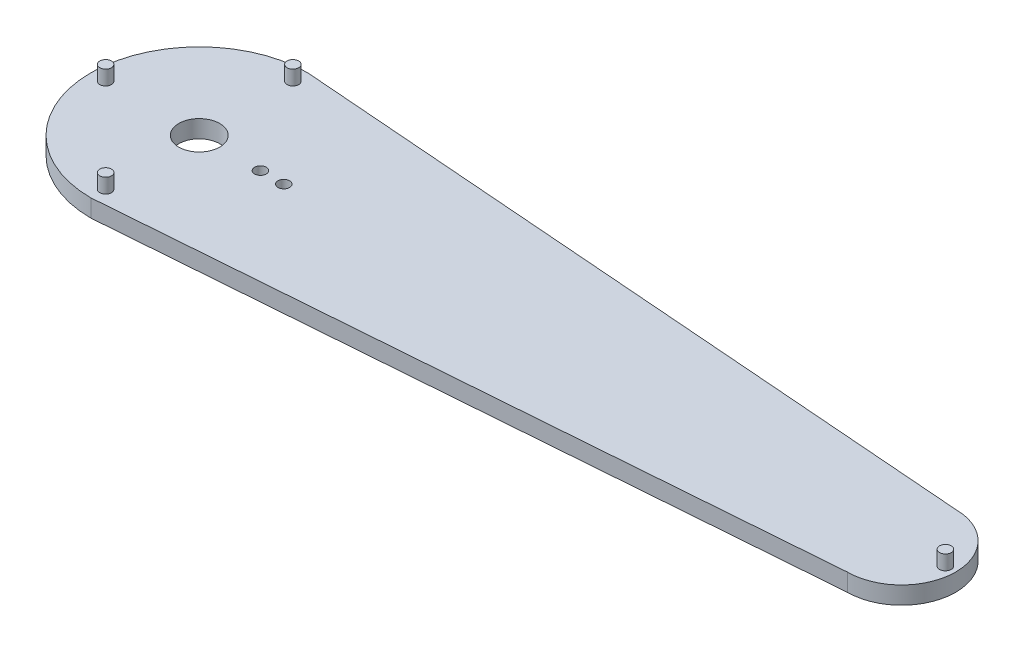
ISO-10303-21;
HEADER;
FILE_DESCRIPTION(('STEP AP214'),'2;1');
FILE_NAME('part.step','',(''),(''),'','','');
FILE_SCHEMA(('AUTOMOTIVE_DESIGN { 1 0 10303 214 1 1 1 1 }'));
ENDSEC;
DATA;
#1=APPLICATION_CONTEXT('core data for automotive mechanical design processes');
#2=APPLICATION_PROTOCOL_DEFINITION('international standard','automotive_design',2000,#1);
#3=PRODUCT_CONTEXT('',#1,'mechanical');
#4=PRODUCT('Part','Part','',(#3));
#5=PRODUCT_RELATED_PRODUCT_CATEGORY('part','',(#4));
#6=PRODUCT_DEFINITION_FORMATION('','',#4);
#7=PRODUCT_DEFINITION_CONTEXT('part definition',#1,'design');
#8=PRODUCT_DEFINITION('design','',#6,#7);
#9=PRODUCT_DEFINITION_SHAPE('','',#8);
#10=(LENGTH_UNIT() NAMED_UNIT(*) SI_UNIT(.MILLI.,.METRE.));
#11=(NAMED_UNIT(*) PLANE_ANGLE_UNIT() SI_UNIT($,.RADIAN.));
#12=(NAMED_UNIT(*) SI_UNIT($,.STERADIAN.) SOLID_ANGLE_UNIT());
#13=UNCERTAINTY_MEASURE_WITH_UNIT(LENGTH_MEASURE(1.E-05),#10,'distance_accuracy_value','');
#14=(GEOMETRIC_REPRESENTATION_CONTEXT(3) GLOBAL_UNCERTAINTY_ASSIGNED_CONTEXT((#13)) GLOBAL_UNIT_ASSIGNED_CONTEXT((#10,
#11,#12)) REPRESENTATION_CONTEXT('',''));
#15=CARTESIAN_POINT('',(0.,0.,0.));
#16=DIRECTION('',(0.,0.,1.));
#17=DIRECTION('',(1.,0.,0.));
#18=AXIS2_PLACEMENT_3D('',#15,#16,#17);
#19=CARTESIAN_POINT('',(0.,3.,0.));
#20=DIRECTION('',(0.,1.,0.));
#21=DIRECTION('',(0.,0.,1.));
#22=AXIS2_PLACEMENT_3D('',#19,#20,#21);
#23=PLANE('',#22);
#24=CARTESIAN_POINT('',(127.5,3.,0.));
#25=DIRECTION('',(0.,1.,0.));
#26=DIRECTION('',(0.,0.,1.));
#27=AXIS2_PLACEMENT_3D('',#24,#25,#26);
#28=CIRCLE('',#27,0.999999999999998);
#29=CARTESIAN_POINT('',(127.5,3.,0.999999999999998));
#30=VERTEX_POINT('',#29);
#31=EDGE_CURVE('E178',#30,#30,#28,.T.);
#32=ORIENTED_EDGE('',*,*,#31,.F.);
#33=EDGE_LOOP('',(#32));
#34=FACE_BOUND('',#33,.T.);
#35=CARTESIAN_POINT('',(0.,3.,16.));
#36=DIRECTION('',(0.,1.,0.));
#37=DIRECTION('',(0.,0.,1.));
#38=AXIS2_PLACEMENT_3D('',#35,#36,#37);
#39=CIRCLE('',#38,1.);
#40=CARTESIAN_POINT('',(0.,3.,17.));
#41=VERTEX_POINT('',#40);
#42=EDGE_CURVE('E170',#41,#41,#39,.T.);
#43=ORIENTED_EDGE('',*,*,#42,.F.);
#44=EDGE_LOOP('',(#43));
#45=FACE_BOUND('',#44,.T.);
#46=CARTESIAN_POINT('',(0.,3.,-16.));
#47=DIRECTION('',(0.,1.,0.));
#48=DIRECTION('',(0.,0.,1.));
#49=AXIS2_PLACEMENT_3D('',#46,#47,#48);
#50=CIRCLE('',#49,1.);
#51=CARTESIAN_POINT('',(0.,3.,-15.));
#52=VERTEX_POINT('',#51);
#53=EDGE_CURVE('E162',#52,#52,#50,.T.);
#54=ORIENTED_EDGE('',*,*,#53,.F.);
#55=EDGE_LOOP('',(#54));
#56=FACE_BOUND('',#55,.T.);
#57=CARTESIAN_POINT('',(-16.,3.,0.));
#58=DIRECTION('',(0.,1.,0.));
#59=DIRECTION('',(0.,0.,1.));
#60=AXIS2_PLACEMENT_3D('',#57,#58,#59);
#61=CIRCLE('',#60,1.);
#62=CARTESIAN_POINT('',(-16.,3.,1.));
#63=VERTEX_POINT('',#62);
#64=EDGE_CURVE('E158',#63,#63,#61,.T.);
#65=ORIENTED_EDGE('',*,*,#64,.F.);
#66=EDGE_LOOP('',(#65));
#67=FACE_BOUND('',#66,.T.);
#68=CARTESIAN_POINT('',(14.45,3.,0.));
#69=DIRECTION('',(0.,1.,0.));
#70=DIRECTION('',(0.,0.,1.));
#71=AXIS2_PLACEMENT_3D('',#68,#69,#70);
#72=CIRCLE('',#71,1.);
#73=CARTESIAN_POINT('',(14.45,3.,1.));
#74=VERTEX_POINT('',#73);
#75=EDGE_CURVE('E138',#74,#74,#72,.T.);
#76=ORIENTED_EDGE('',*,*,#75,.F.);
#77=EDGE_LOOP('',(#76));
#78=FACE_BOUND('',#77,.T.);
#79=CARTESIAN_POINT('',(0.,3.,0.));
#80=DIRECTION('',(0.,1.,0.));
#81=DIRECTION('',(0.,0.,1.));
#82=AXIS2_PLACEMENT_3D('',#79,#80,#81);
#83=CIRCLE('',#82,18.5169503651855);
#84=CARTESIAN_POINT('',(0.,3.,-18.5169503651855));
#85=VERTEX_POINT('',#84);
#86=CARTESIAN_POINT('',(0.,3.,18.5169503651855));
#87=VERTEX_POINT('',#86);
#88=EDGE_CURVE('E96',#85,#87,#83,.T.);
#89=ORIENTED_EDGE('',*,*,#88,.T.);
#90=DIRECTION('',(0.997036855802212,0.,-0.0769253415464591));
#91=VECTOR('',#90,1.);
#92=CARTESIAN_POINT('',(0.,3.,18.5169503651855));
#93=LINE('',#92,#91);
#94=CARTESIAN_POINT('',(120.,3.,9.25847518259273));
#95=VERTEX_POINT('',#94);
#96=EDGE_CURVE('E91',#87,#95,#93,.T.);
#97=ORIENTED_EDGE('',*,*,#96,.T.);
#98=CARTESIAN_POINT('',(120.,3.,0.));
#99=DIRECTION('',(0.,1.,0.));
#100=DIRECTION('',(0.,0.,1.));
#101=AXIS2_PLACEMENT_3D('',#98,#99,#100);
#102=CIRCLE('',#101,9.25847518259273);
#103=CARTESIAN_POINT('',(120.,3.,-9.25847518259273));
#104=VERTEX_POINT('',#103);
#105=EDGE_CURVE('E94',#95,#104,#102,.T.);
#106=ORIENTED_EDGE('',*,*,#105,.T.);
#107=DIRECTION('',(-0.997036855802212,0.,-0.0769253415464591));
#108=VECTOR('',#107,1.);
#109=CARTESIAN_POINT('',(0.,3.,-18.5169503651855));
#110=LINE('',#109,#108);
#111=EDGE_CURVE('E61',#104,#85,#110,.T.);
#112=ORIENTED_EDGE('',*,*,#111,.T.);
#113=EDGE_LOOP('',(#89,#97,#106,#112));
#114=FACE_BOUND('',#113,.T.);
#115=CARTESIAN_POINT('',(0.,3.,0.));
#116=DIRECTION('',(0.,1.,0.));
#117=DIRECTION('',(0.,0.,1.));
#118=AXIS2_PLACEMENT_3D('',#115,#116,#117);
#119=CIRCLE('',#118,3.5);
#120=CARTESIAN_POINT('',(0.,3.,3.5));
#121=VERTEX_POINT('',#120);
#122=EDGE_CURVE('E116',#121,#121,#119,.T.);
#123=ORIENTED_EDGE('',*,*,#122,.F.);
#124=EDGE_LOOP('',(#123));
#125=FACE_BOUND('',#124,.T.);
#126=CARTESIAN_POINT('',(10.45,3.,0.));
#127=DIRECTION('',(0.,1.,0.));
#128=DIRECTION('',(0.,0.,1.));
#129=AXIS2_PLACEMENT_3D('',#126,#127,#128);
#130=CIRCLE('',#129,1.);
#131=CARTESIAN_POINT('',(10.45,3.,1.));
#132=VERTEX_POINT('',#131);
#133=EDGE_CURVE('E146',#132,#132,#130,.T.);
#134=ORIENTED_EDGE('',*,*,#133,.F.);
#135=EDGE_LOOP('',(#134));
#136=FACE_BOUND('',#135,.T.);
#137=ADVANCED_FACE('F43',(#34,#45,#56,#67,#78,#114,#125,#136),#23,.T.);
#138=CARTESIAN_POINT('',(0.,0.,0.));
#139=DIRECTION('',(0.,1.,0.));
#140=DIRECTION('',(0.,0.,1.));
#141=AXIS2_PLACEMENT_3D('',#138,#139,#140);
#142=PLANE('',#141);
#143=CARTESIAN_POINT('',(0.,0.,0.));
#144=DIRECTION('',(0.,1.,0.));
#145=DIRECTION('',(0.,0.,1.));
#146=AXIS2_PLACEMENT_3D('',#143,#144,#145);
#147=CIRCLE('',#146,18.5169503651855);
#148=CARTESIAN_POINT('',(0.,0.,-18.5169503651855));
#149=VERTEX_POINT('',#148);
#150=CARTESIAN_POINT('',(0.,0.,18.5169503651855));
#151=VERTEX_POINT('',#150);
#152=EDGE_CURVE('E112',#149,#151,#147,.T.);
#153=ORIENTED_EDGE('',*,*,#152,.F.);
#154=DIRECTION('',(-0.997036855802212,0.,-0.0769253415464591));
#155=VECTOR('',#154,1.);
#156=CARTESIAN_POINT('',(0.,0.,-18.5169503651855));
#157=LINE('',#156,#155);
#158=CARTESIAN_POINT('',(120.,0.,-9.25847518259273));
#159=VERTEX_POINT('',#158);
#160=EDGE_CURVE('E84',#159,#149,#157,.T.);
#161=ORIENTED_EDGE('',*,*,#160,.F.);
#162=CARTESIAN_POINT('',(120.,0.,0.));
#163=DIRECTION('',(0.,1.,0.));
#164=DIRECTION('',(0.,0.,1.));
#165=AXIS2_PLACEMENT_3D('',#162,#163,#164);
#166=CIRCLE('',#165,9.25847518259273);
#167=CARTESIAN_POINT('',(120.,0.,9.25847518259273));
#168=VERTEX_POINT('',#167);
#169=EDGE_CURVE('E78',#168,#159,#166,.T.);
#170=ORIENTED_EDGE('',*,*,#169,.F.);
#171=DIRECTION('',(0.997036855802212,0.,-0.0769253415464591));
#172=VECTOR('',#171,1.);
#173=CARTESIAN_POINT('',(0.,0.,18.5169503651855));
#174=LINE('',#173,#172);
#175=EDGE_CURVE('E101',#151,#168,#174,.T.);
#176=ORIENTED_EDGE('',*,*,#175,.F.);
#177=EDGE_LOOP('',(#153,#161,#170,#176));
#178=FACE_BOUND('',#177,.T.);
#179=CARTESIAN_POINT('',(0.,0.,0.));
#180=DIRECTION('',(0.,1.,0.));
#181=DIRECTION('',(0.,0.,1.));
#182=AXIS2_PLACEMENT_3D('',#179,#180,#181);
#183=CIRCLE('',#182,3.5);
#184=CARTESIAN_POINT('',(0.,0.,3.5));
#185=VERTEX_POINT('',#184);
#186=EDGE_CURVE('E134',#185,#185,#183,.T.);
#187=ORIENTED_EDGE('',*,*,#186,.T.);
#188=EDGE_LOOP('',(#187));
#189=FACE_BOUND('',#188,.T.);
#190=CARTESIAN_POINT('',(14.45,0.,0.));
#191=DIRECTION('',(0.,1.,0.));
#192=DIRECTION('',(0.,0.,1.));
#193=AXIS2_PLACEMENT_3D('',#190,#191,#192);
#194=CIRCLE('',#193,1.);
#195=CARTESIAN_POINT('',(14.45,0.,1.));
#196=VERTEX_POINT('',#195);
#197=EDGE_CURVE('E142',#196,#196,#194,.T.);
#198=ORIENTED_EDGE('',*,*,#197,.T.);
#199=EDGE_LOOP('',(#198));
#200=FACE_BOUND('',#199,.T.);
#201=CARTESIAN_POINT('',(10.45,0.,0.));
#202=DIRECTION('',(0.,1.,0.));
#203=DIRECTION('',(0.,0.,1.));
#204=AXIS2_PLACEMENT_3D('',#201,#202,#203);
#205=CIRCLE('',#204,1.);
#206=CARTESIAN_POINT('',(10.45,0.,1.));
#207=VERTEX_POINT('',#206);
#208=EDGE_CURVE('E150',#207,#207,#205,.T.);
#209=ORIENTED_EDGE('',*,*,#208,.T.);
#210=EDGE_LOOP('',(#209));
#211=FACE_BOUND('',#210,.T.);
#212=ADVANCED_FACE('F129',(#178,#189,#200,#211),#142,.F.);
#213=CARTESIAN_POINT('',(0.,3.,0.));
#214=DIRECTION('',(0.,-1.,0.));
#215=DIRECTION('',(0.,0.,-1.));
#216=AXIS2_PLACEMENT_3D('',#213,#214,#215);
#217=CYLINDRICAL_SURFACE('',#216,18.5169503651855);
#218=ORIENTED_EDGE('',*,*,#152,.T.);
#219=DIRECTION('',(0.,-1.,0.));
#220=VECTOR('',#219,1.);
#221=CARTESIAN_POINT('',(0.,3.,18.5169503651855));
#222=LINE('',#221,#220);
#223=EDGE_CURVE('E11',#87,#151,#222,.T.);
#224=ORIENTED_EDGE('',*,*,#223,.F.);
#225=ORIENTED_EDGE('',*,*,#88,.F.);
#226=DIRECTION('',(0.,-1.,0.));
#227=VECTOR('',#226,1.);
#228=CARTESIAN_POINT('',(0.,3.,-18.5169503651855));
#229=LINE('',#228,#227);
#230=EDGE_CURVE('E108',#85,#149,#229,.T.);
#231=ORIENTED_EDGE('',*,*,#230,.T.);
#232=EDGE_LOOP('',(#218,#224,#225,#231));
#233=FACE_BOUND('',#232,.T.);
#234=ADVANCED_FACE('F45',(#233),#217,.T.);
#235=CARTESIAN_POINT('',(0.,3.,18.5169503651855));
#236=DIRECTION('',(-0.0769253415464591,0.,-0.997036855802212));
#237=DIRECTION('',(-0.997036855802212,0.,0.0769253415464591));
#238=AXIS2_PLACEMENT_3D('',#235,#236,#237);
#239=PLANE('',#238);
#240=ORIENTED_EDGE('',*,*,#175,.T.);
#241=DIRECTION('',(0.,-1.,0.));
#242=VECTOR('',#241,1.);
#243=CARTESIAN_POINT('',(120.,3.,9.25847518259273));
#244=LINE('',#243,#242);
#245=EDGE_CURVE('E53',#95,#168,#244,.T.);
#246=ORIENTED_EDGE('',*,*,#245,.F.);
#247=ORIENTED_EDGE('',*,*,#96,.F.);
#248=ORIENTED_EDGE('',*,*,#223,.T.);
#249=EDGE_LOOP('',(#240,#246,#247,#248));
#250=FACE_BOUND('',#249,.T.);
#251=ADVANCED_FACE('F100',(#250),#239,.F.);
#252=CARTESIAN_POINT('',(120.,3.,0.));
#253=DIRECTION('',(0.,-1.,0.));
#254=DIRECTION('',(0.,0.,-1.));
#255=AXIS2_PLACEMENT_3D('',#252,#253,#254);
#256=CYLINDRICAL_SURFACE('',#255,9.25847518259273);
#257=ORIENTED_EDGE('',*,*,#169,.T.);
#258=DIRECTION('',(0.,-1.,0.));
#259=VECTOR('',#258,1.);
#260=CARTESIAN_POINT('',(120.,3.,-9.25847518259273));
#261=LINE('',#260,#259);
#262=EDGE_CURVE('E103',#104,#159,#261,.T.);
#263=ORIENTED_EDGE('',*,*,#262,.F.);
#264=ORIENTED_EDGE('',*,*,#105,.F.);
#265=ORIENTED_EDGE('',*,*,#245,.T.);
#266=EDGE_LOOP('',(#257,#263,#264,#265));
#267=FACE_BOUND('',#266,.T.);
#268=ADVANCED_FACE('F104',(#267),#256,.T.);
#269=CARTESIAN_POINT('',(0.,3.,-18.5169503651855));
#270=DIRECTION('',(-0.0769253415464591,0.,0.997036855802212));
#271=DIRECTION('',(0.997036855802212,0.,0.0769253415464591));
#272=AXIS2_PLACEMENT_3D('',#269,#270,#271);
#273=PLANE('',#272);
#274=ORIENTED_EDGE('',*,*,#160,.T.);
#275=ORIENTED_EDGE('',*,*,#230,.F.);
#276=ORIENTED_EDGE('',*,*,#111,.F.);
#277=ORIENTED_EDGE('',*,*,#262,.T.);
#278=EDGE_LOOP('',(#274,#275,#276,#277));
#279=FACE_BOUND('',#278,.T.);
#280=ADVANCED_FACE('F126',(#279),#273,.F.);
#281=CARTESIAN_POINT('',(0.,3.,0.));
#282=DIRECTION('',(0.,-1.,0.));
#283=DIRECTION('',(0.,0.,-1.));
#284=AXIS2_PLACEMENT_3D('',#281,#282,#283);
#285=CYLINDRICAL_SURFACE('',#284,3.5);
#286=ORIENTED_EDGE('',*,*,#122,.T.);
#287=EDGE_LOOP('',(#286));
#288=FACE_BOUND('',#287,.T.);
#289=ORIENTED_EDGE('',*,*,#186,.F.);
#290=EDGE_LOOP('',(#289));
#291=FACE_BOUND('',#290,.T.);
#292=ADVANCED_FACE('F207',(#288,#291),#285,.F.);
#293=CARTESIAN_POINT('',(14.45,3.,0.));
#294=DIRECTION('',(0.,-1.,0.));
#295=DIRECTION('',(0.,0.,-1.));
#296=AXIS2_PLACEMENT_3D('',#293,#294,#295);
#297=CYLINDRICAL_SURFACE('',#296,1.);
#298=ORIENTED_EDGE('',*,*,#75,.T.);
#299=EDGE_LOOP('',(#298));
#300=FACE_BOUND('',#299,.T.);
#301=ORIENTED_EDGE('',*,*,#197,.F.);
#302=EDGE_LOOP('',(#301));
#303=FACE_BOUND('',#302,.T.);
#304=ADVANCED_FACE('F203',(#300,#303),#297,.F.);
#305=CARTESIAN_POINT('',(10.45,3.,0.));
#306=DIRECTION('',(0.,-1.,0.));
#307=DIRECTION('',(0.,0.,-1.));
#308=AXIS2_PLACEMENT_3D('',#305,#306,#307);
#309=CYLINDRICAL_SURFACE('',#308,1.);
#310=ORIENTED_EDGE('',*,*,#133,.T.);
#311=EDGE_LOOP('',(#310));
#312=FACE_BOUND('',#311,.T.);
#313=ORIENTED_EDGE('',*,*,#208,.F.);
#314=EDGE_LOOP('',(#313));
#315=FACE_BOUND('',#314,.T.);
#316=ADVANCED_FACE('F206',(#312,#315),#309,.F.);
#317=CARTESIAN_POINT('',(-16.,5.5,0.));
#318=DIRECTION('',(0.,-1.,0.));
#319=DIRECTION('',(0.,0.,-1.));
#320=AXIS2_PLACEMENT_3D('',#317,#318,#319);
#321=CYLINDRICAL_SURFACE('',#320,1.);
#322=CARTESIAN_POINT('',(-16.,5.5,0.));
#323=DIRECTION('',(0.,1.,0.));
#324=DIRECTION('',(0.,0.,1.));
#325=AXIS2_PLACEMENT_3D('',#322,#323,#324);
#326=CIRCLE('',#325,1.);
#327=CARTESIAN_POINT('',(-16.,5.5,1.));
#328=VERTEX_POINT('',#327);
#329=EDGE_CURVE('E154',#328,#328,#326,.T.);
#330=ORIENTED_EDGE('',*,*,#329,.F.);
#331=EDGE_LOOP('',(#330));
#332=FACE_BOUND('',#331,.T.);
#333=ORIENTED_EDGE('',*,*,#64,.T.);
#334=EDGE_LOOP('',(#333));
#335=FACE_BOUND('',#334,.T.);
#336=ADVANCED_FACE('F217',(#332,#335),#321,.T.);
#337=CARTESIAN_POINT('',(-16.,5.5,0.));
#338=DIRECTION('',(0.,1.,0.));
#339=DIRECTION('',(0.,0.,1.));
#340=AXIS2_PLACEMENT_3D('',#337,#338,#339);
#341=PLANE('',#340);
#342=ORIENTED_EDGE('',*,*,#329,.T.);
#343=EDGE_LOOP('',(#342));
#344=FACE_BOUND('',#343,.T.);
#345=ADVANCED_FACE('F223',(#344),#341,.T.);
#346=CARTESIAN_POINT('',(0.,5.5,-16.));
#347=DIRECTION('',(0.,-1.,0.));
#348=DIRECTION('',(0.,0.,-1.));
#349=AXIS2_PLACEMENT_3D('',#346,#347,#348);
#350=CYLINDRICAL_SURFACE('',#349,1.);
#351=CARTESIAN_POINT('',(0.,5.5,-16.));
#352=DIRECTION('',(0.,1.,0.));
#353=DIRECTION('',(0.,0.,1.));
#354=AXIS2_PLACEMENT_3D('',#351,#352,#353);
#355=CIRCLE('',#354,1.);
#356=CARTESIAN_POINT('',(0.,5.5,-15.));
#357=VERTEX_POINT('',#356);
#358=EDGE_CURVE('E166',#357,#357,#355,.T.);
#359=ORIENTED_EDGE('',*,*,#358,.F.);
#360=EDGE_LOOP('',(#359));
#361=FACE_BOUND('',#360,.T.);
#362=ORIENTED_EDGE('',*,*,#53,.T.);
#363=EDGE_LOOP('',(#362));
#364=FACE_BOUND('',#363,.T.);
#365=ADVANCED_FACE('F268',(#361,#364),#350,.T.);
#366=CARTESIAN_POINT('',(0.,5.5,-16.));
#367=DIRECTION('',(0.,1.,0.));
#368=DIRECTION('',(0.,0.,1.));
#369=AXIS2_PLACEMENT_3D('',#366,#367,#368);
#370=PLANE('',#369);
#371=ORIENTED_EDGE('',*,*,#358,.T.);
#372=EDGE_LOOP('',(#371));
#373=FACE_BOUND('',#372,.T.);
#374=ADVANCED_FACE('F278',(#373),#370,.T.);
#375=CARTESIAN_POINT('',(0.,5.5,16.));
#376=DIRECTION('',(0.,-1.,0.));
#377=DIRECTION('',(0.,0.,-1.));
#378=AXIS2_PLACEMENT_3D('',#375,#376,#377);
#379=CYLINDRICAL_SURFACE('',#378,1.);
#380=CARTESIAN_POINT('',(0.,5.5,16.));
#381=DIRECTION('',(0.,1.,0.));
#382=DIRECTION('',(0.,0.,1.));
#383=AXIS2_PLACEMENT_3D('',#380,#381,#382);
#384=CIRCLE('',#383,1.);
#385=CARTESIAN_POINT('',(0.,5.5,17.));
#386=VERTEX_POINT('',#385);
#387=EDGE_CURVE('E174',#386,#386,#384,.T.);
#388=ORIENTED_EDGE('',*,*,#387,.F.);
#389=EDGE_LOOP('',(#388));
#390=FACE_BOUND('',#389,.T.);
#391=ORIENTED_EDGE('',*,*,#42,.T.);
#392=EDGE_LOOP('',(#391));
#393=FACE_BOUND('',#392,.T.);
#394=ADVANCED_FACE('F289',(#390,#393),#379,.T.);
#395=CARTESIAN_POINT('',(0.,5.5,16.));
#396=DIRECTION('',(0.,1.,0.));
#397=DIRECTION('',(0.,0.,1.));
#398=AXIS2_PLACEMENT_3D('',#395,#396,#397);
#399=PLANE('',#398);
#400=ORIENTED_EDGE('',*,*,#387,.T.);
#401=EDGE_LOOP('',(#400));
#402=FACE_BOUND('',#401,.T.);
#403=ADVANCED_FACE('F300',(#402),#399,.T.);
#404=CARTESIAN_POINT('',(127.5,5.5,0.));
#405=DIRECTION('',(0.,-1.,0.));
#406=DIRECTION('',(0.,0.,-1.));
#407=AXIS2_PLACEMENT_3D('',#404,#405,#406);
#408=CYLINDRICAL_SURFACE('',#407,0.999999999999998);
#409=CARTESIAN_POINT('',(127.5,5.5,0.));
#410=DIRECTION('',(0.,1.,0.));
#411=DIRECTION('',(0.,0.,1.));
#412=AXIS2_PLACEMENT_3D('',#409,#410,#411);
#413=CIRCLE('',#412,0.999999999999998);
#414=CARTESIAN_POINT('',(127.5,5.5,0.999999999999998));
#415=VERTEX_POINT('',#414);
#416=EDGE_CURVE('E182',#415,#415,#413,.T.);
#417=ORIENTED_EDGE('',*,*,#416,.F.);
#418=EDGE_LOOP('',(#417));
#419=FACE_BOUND('',#418,.T.);
#420=ORIENTED_EDGE('',*,*,#31,.T.);
#421=EDGE_LOOP('',(#420));
#422=FACE_BOUND('',#421,.T.);
#423=ADVANCED_FACE('F190',(#419,#422),#408,.T.);
#424=CARTESIAN_POINT('',(127.5,5.5,0.));
#425=DIRECTION('',(0.,1.,0.));
#426=DIRECTION('',(0.,0.,1.));
#427=AXIS2_PLACEMENT_3D('',#424,#425,#426);
#428=PLANE('',#427);
#429=ORIENTED_EDGE('',*,*,#416,.T.);
#430=EDGE_LOOP('',(#429));
#431=FACE_BOUND('',#430,.T.);
#432=ADVANCED_FACE('F321',(#431),#428,.T.);
#433=CLOSED_SHELL('',(#137,#212,#234,#251,#268,#280,#292,#304,#316,#336,#345,#365,#374,#394,
#403,#423,#432));
#434=MANIFOLD_SOLID_BREP('B2',#433);
#435=ADVANCED_BREP_SHAPE_REPRESENTATION('',(#18,#434),#14);
#436=SHAPE_DEFINITION_REPRESENTATION(#9,#435);
ENDSEC;
END-ISO-10303-21;
